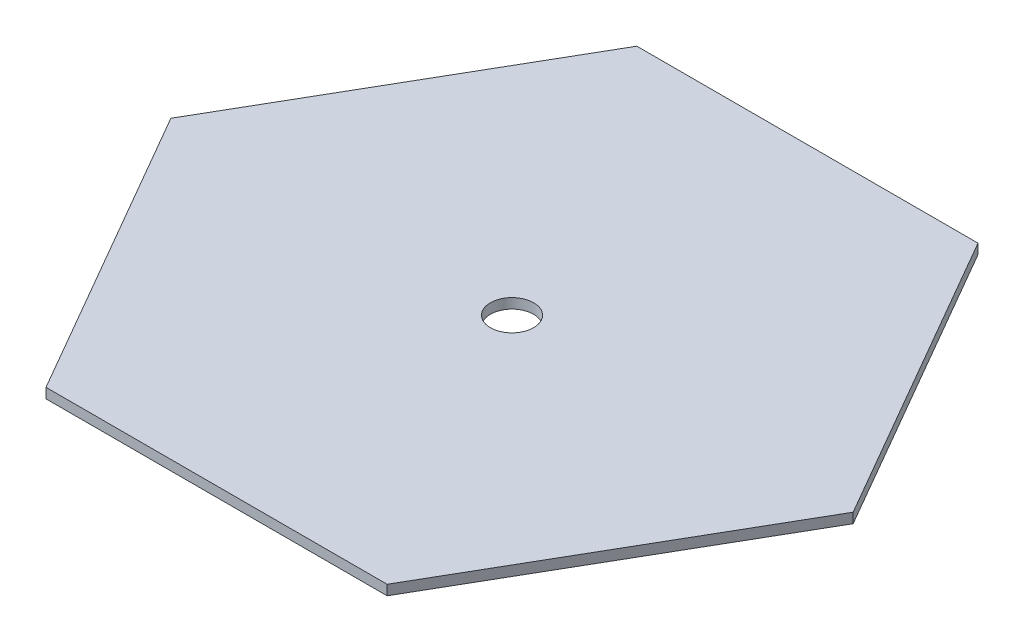
ISO-10303-21;
HEADER;
FILE_DESCRIPTION(('STEP AP214'),'2;1');
FILE_NAME('part.step','',(''),(''),'','','');
FILE_SCHEMA(('AUTOMOTIVE_DESIGN { 1 0 10303 214 1 1 1 1 }'));
ENDSEC;
DATA;
#1=APPLICATION_CONTEXT('core data for automotive mechanical design processes');
#2=APPLICATION_PROTOCOL_DEFINITION('international standard','automotive_design',2000,#1);
#3=PRODUCT_CONTEXT('',#1,'mechanical');
#4=PRODUCT('Part','Part','',(#3));
#5=PRODUCT_RELATED_PRODUCT_CATEGORY('part','',(#4));
#6=PRODUCT_DEFINITION_FORMATION('','',#4);
#7=PRODUCT_DEFINITION_CONTEXT('part definition',#1,'design');
#8=PRODUCT_DEFINITION('design','',#6,#7);
#9=PRODUCT_DEFINITION_SHAPE('','',#8);
#10=(LENGTH_UNIT() NAMED_UNIT(*) SI_UNIT(.MILLI.,.METRE.));
#11=(NAMED_UNIT(*) PLANE_ANGLE_UNIT() SI_UNIT($,.RADIAN.));
#12=(NAMED_UNIT(*) SI_UNIT($,.STERADIAN.) SOLID_ANGLE_UNIT());
#13=UNCERTAINTY_MEASURE_WITH_UNIT(LENGTH_MEASURE(1.E-05),#10,'distance_accuracy_value','');
#14=(GEOMETRIC_REPRESENTATION_CONTEXT(3) GLOBAL_UNCERTAINTY_ASSIGNED_CONTEXT((#13)) GLOBAL_UNIT_ASSIGNED_CONTEXT((#10,
#11,#12)) REPRESENTATION_CONTEXT('',''));
#15=CARTESIAN_POINT('',(0.,0.,0.));
#16=DIRECTION('',(0.,0.,1.));
#17=DIRECTION('',(1.,0.,0.));
#18=AXIS2_PLACEMENT_3D('',#15,#16,#17);
#19=CARTESIAN_POINT('',(0.,5.,0.));
#20=DIRECTION('',(0.,1.,0.));
#21=DIRECTION('',(0.,0.,1.));
#22=AXIS2_PLACEMENT_3D('',#19,#20,#21);
#23=PLANE('',#22);
#24=DIRECTION('',(1.,0.,0.));
#25=VECTOR('',#24,1.);
#26=CARTESIAN_POINT('',(-85.25,5.,147.657331345247));
#27=LINE('',#26,#25);
#28=CARTESIAN_POINT('',(-85.25,5.,147.657331345247));
#29=VERTEX_POINT('',#28);
#30=CARTESIAN_POINT('',(85.25,5.,147.657331345247));
#31=VERTEX_POINT('',#30);
#32=EDGE_CURVE('E129',#29,#31,#27,.T.);
#33=ORIENTED_EDGE('',*,*,#32,.T.);
#34=DIRECTION('',(0.5,0.,-0.866025403784439));
#35=VECTOR('',#34,1.);
#36=CARTESIAN_POINT('',(85.25,5.,147.657331345247));
#37=LINE('',#36,#35);
#38=CARTESIAN_POINT('',(170.5,5.,0.));
#39=VERTEX_POINT('',#38);
#40=EDGE_CURVE('E87',#31,#39,#37,.T.);
#41=ORIENTED_EDGE('',*,*,#40,.T.);
#42=DIRECTION('',(-0.5,0.,-0.866025403784439));
#43=VECTOR('',#42,1.);
#44=CARTESIAN_POINT('',(170.5,5.,0.));
#45=LINE('',#44,#43);
#46=CARTESIAN_POINT('',(85.25,5.,-147.657331345247));
#47=VERTEX_POINT('',#46);
#48=EDGE_CURVE('E100',#39,#47,#45,.T.);
#49=ORIENTED_EDGE('',*,*,#48,.T.);
#50=DIRECTION('',(-1.,0.,0.));
#51=VECTOR('',#50,1.);
#52=CARTESIAN_POINT('',(85.25,5.,-147.657331345247));
#53=LINE('',#52,#51);
#54=CARTESIAN_POINT('',(-85.25,5.,-147.657331345247));
#55=VERTEX_POINT('',#54);
#56=EDGE_CURVE('E94',#47,#55,#53,.T.);
#57=ORIENTED_EDGE('',*,*,#56,.T.);
#58=DIRECTION('',(-0.5,0.,0.866025403784439));
#59=VECTOR('',#58,1.);
#60=CARTESIAN_POINT('',(-85.25,5.,-147.657331345247));
#61=LINE('',#60,#59);
#62=CARTESIAN_POINT('',(-170.5,5.,0.));
#63=VERTEX_POINT('',#62);
#64=EDGE_CURVE('E98',#55,#63,#61,.T.);
#65=ORIENTED_EDGE('',*,*,#64,.T.);
#66=DIRECTION('',(0.5,0.,0.866025403784439));
#67=VECTOR('',#66,1.);
#68=CARTESIAN_POINT('',(-170.5,5.,0.));
#69=LINE('',#68,#67);
#70=EDGE_CURVE('E50',#63,#29,#69,.T.);
#71=ORIENTED_EDGE('',*,*,#70,.T.);
#72=EDGE_LOOP('',(#33,#41,#49,#57,#65,#71));
#73=FACE_BOUND('',#72,.T.);
#74=CARTESIAN_POINT('',(0.,5.,0.));
#75=DIRECTION('',(0.,1.,0.));
#76=DIRECTION('',(0.,0.,1.));
#77=AXIS2_PLACEMENT_3D('',#74,#75,#76);
#78=CIRCLE('',#77,10.81);
#79=CARTESIAN_POINT('',(0.,5.,10.81));
#80=VERTEX_POINT('',#79);
#81=EDGE_CURVE('E122',#80,#80,#78,.T.);
#82=ORIENTED_EDGE('',*,*,#81,.F.);
#83=EDGE_LOOP('',(#82));
#84=FACE_BOUND('',#83,.T.);
#85=ADVANCED_FACE('F33',(#73,#84),#23,.T.);
#86=CARTESIAN_POINT('',(0.,0.,0.));
#87=DIRECTION('',(0.,1.,0.));
#88=DIRECTION('',(0.,0.,1.));
#89=AXIS2_PLACEMENT_3D('',#86,#87,#88);
#90=PLANE('',#89);
#91=DIRECTION('',(1.,0.,0.));
#92=VECTOR('',#91,1.);
#93=CARTESIAN_POINT('',(-85.25,0.,147.657331345247));
#94=LINE('',#93,#92);
#95=CARTESIAN_POINT('',(-85.25,0.,147.657331345247));
#96=VERTEX_POINT('',#95);
#97=CARTESIAN_POINT('',(85.25,0.,147.657331345247));
#98=VERTEX_POINT('',#97);
#99=EDGE_CURVE('E118',#96,#98,#94,.T.);
#100=ORIENTED_EDGE('',*,*,#99,.F.);
#101=DIRECTION('',(0.5,0.,0.866025403784439));
#102=VECTOR('',#101,1.);
#103=CARTESIAN_POINT('',(-170.5,0.,0.));
#104=LINE('',#103,#102);
#105=CARTESIAN_POINT('',(-170.5,0.,0.));
#106=VERTEX_POINT('',#105);
#107=EDGE_CURVE('E79',#106,#96,#104,.T.);
#108=ORIENTED_EDGE('',*,*,#107,.F.);
#109=DIRECTION('',(-0.5,0.,0.866025403784439));
#110=VECTOR('',#109,1.);
#111=CARTESIAN_POINT('',(-85.25,0.,-147.657331345247));
#112=LINE('',#111,#110);
#113=CARTESIAN_POINT('',(-85.25,0.,-147.657331345247));
#114=VERTEX_POINT('',#113);
#115=EDGE_CURVE('E73',#114,#106,#112,.T.);
#116=ORIENTED_EDGE('',*,*,#115,.F.);
#117=DIRECTION('',(-1.,0.,0.));
#118=VECTOR('',#117,1.);
#119=CARTESIAN_POINT('',(85.25,0.,-147.657331345247));
#120=LINE('',#119,#118);
#121=CARTESIAN_POINT('',(85.25,0.,-147.657331345247));
#122=VERTEX_POINT('',#121);
#123=EDGE_CURVE('E108',#122,#114,#120,.T.);
#124=ORIENTED_EDGE('',*,*,#123,.F.);
#125=DIRECTION('',(-0.5,0.,-0.866025403784439));
#126=VECTOR('',#125,1.);
#127=CARTESIAN_POINT('',(170.5,0.,0.));
#128=LINE('',#127,#126);
#129=CARTESIAN_POINT('',(170.5,0.,0.));
#130=VERTEX_POINT('',#129);
#131=EDGE_CURVE('E124',#130,#122,#128,.T.);
#132=ORIENTED_EDGE('',*,*,#131,.F.);
#133=DIRECTION('',(0.5,0.,-0.866025403784439));
#134=VECTOR('',#133,1.);
#135=CARTESIAN_POINT('',(85.25,0.,147.657331345247));
#136=LINE('',#135,#134);
#137=EDGE_CURVE('E121',#98,#130,#136,.T.);
#138=ORIENTED_EDGE('',*,*,#137,.F.);
#139=EDGE_LOOP('',(#100,#108,#116,#124,#132,#138));
#140=FACE_BOUND('',#139,.T.);
#141=CARTESIAN_POINT('',(0.,0.,0.));
#142=DIRECTION('',(0.,1.,0.));
#143=DIRECTION('',(0.,0.,1.));
#144=AXIS2_PLACEMENT_3D('',#141,#142,#143);
#145=CIRCLE('',#144,10.81);
#146=CARTESIAN_POINT('',(0.,0.,10.81));
#147=VERTEX_POINT('',#146);
#148=EDGE_CURVE('E222',#147,#147,#145,.T.);
#149=ORIENTED_EDGE('',*,*,#148,.T.);
#150=EDGE_LOOP('',(#149));
#151=FACE_BOUND('',#150,.T.);
#152=ADVANCED_FACE('F138',(#140,#151),#90,.F.);
#153=CARTESIAN_POINT('',(-85.25,5.,147.657331345247));
#154=DIRECTION('',(0.,0.,-1.));
#155=DIRECTION('',(-1.,0.,0.));
#156=AXIS2_PLACEMENT_3D('',#153,#154,#155);
#157=PLANE('',#156);
#158=ORIENTED_EDGE('',*,*,#99,.T.);
#159=DIRECTION('',(0.,-1.,0.));
#160=VECTOR('',#159,1.);
#161=CARTESIAN_POINT('',(85.25,5.,147.657331345247));
#162=LINE('',#161,#160);
#163=EDGE_CURVE('E11',#31,#98,#162,.T.);
#164=ORIENTED_EDGE('',*,*,#163,.F.);
#165=ORIENTED_EDGE('',*,*,#32,.F.);
#166=DIRECTION('',(0.,-1.,0.));
#167=VECTOR('',#166,1.);
#168=CARTESIAN_POINT('',(-85.25,5.,147.657331345247));
#169=LINE('',#168,#167);
#170=EDGE_CURVE('E114',#29,#96,#169,.T.);
#171=ORIENTED_EDGE('',*,*,#170,.T.);
#172=EDGE_LOOP('',(#158,#164,#165,#171));
#173=FACE_BOUND('',#172,.T.);
#174=ADVANCED_FACE('F35',(#173),#157,.F.);
#175=CARTESIAN_POINT('',(85.25,5.,147.657331345247));
#176=DIRECTION('',(-0.866025403784439,0.,-0.5));
#177=DIRECTION('',(-0.5,0.,0.866025403784439));
#178=AXIS2_PLACEMENT_3D('',#175,#176,#177);
#179=PLANE('',#178);
#180=ORIENTED_EDGE('',*,*,#137,.T.);
#181=DIRECTION('',(0.,-1.,0.));
#182=VECTOR('',#181,1.);
#183=CARTESIAN_POINT('',(170.5,5.,0.));
#184=LINE('',#183,#182);
#185=EDGE_CURVE('E42',#39,#130,#184,.T.);
#186=ORIENTED_EDGE('',*,*,#185,.F.);
#187=ORIENTED_EDGE('',*,*,#40,.F.);
#188=ORIENTED_EDGE('',*,*,#163,.T.);
#189=EDGE_LOOP('',(#180,#186,#187,#188));
#190=FACE_BOUND('',#189,.T.);
#191=ADVANCED_FACE('F163',(#190),#179,.F.);
#192=CARTESIAN_POINT('',(170.5,5.,0.));
#193=DIRECTION('',(-0.866025403784439,0.,0.5));
#194=DIRECTION('',(0.5,0.,0.866025403784439));
#195=AXIS2_PLACEMENT_3D('',#192,#193,#194);
#196=PLANE('',#195);
#197=ORIENTED_EDGE('',*,*,#131,.T.);
#198=DIRECTION('',(0.,-1.,0.));
#199=VECTOR('',#198,1.);
#200=CARTESIAN_POINT('',(85.25,5.,-147.657331345247));
#201=LINE('',#200,#199);
#202=EDGE_CURVE('E109',#47,#122,#201,.T.);
#203=ORIENTED_EDGE('',*,*,#202,.F.);
#204=ORIENTED_EDGE('',*,*,#48,.F.);
#205=ORIENTED_EDGE('',*,*,#185,.T.);
#206=EDGE_LOOP('',(#197,#203,#204,#205));
#207=FACE_BOUND('',#206,.T.);
#208=ADVANCED_FACE('F135',(#207),#196,.F.);
#209=CARTESIAN_POINT('',(85.25,5.,-147.657331345247));
#210=DIRECTION('',(0.,0.,1.));
#211=DIRECTION('',(1.,0.,0.));
#212=AXIS2_PLACEMENT_3D('',#209,#210,#211);
#213=PLANE('',#212);
#214=ORIENTED_EDGE('',*,*,#123,.T.);
#215=DIRECTION('',(0.,-1.,0.));
#216=VECTOR('',#215,1.);
#217=CARTESIAN_POINT('',(-85.25,5.,-147.657331345247));
#218=LINE('',#217,#216);
#219=EDGE_CURVE('E105',#55,#114,#218,.T.);
#220=ORIENTED_EDGE('',*,*,#219,.F.);
#221=ORIENTED_EDGE('',*,*,#56,.F.);
#222=ORIENTED_EDGE('',*,*,#202,.T.);
#223=EDGE_LOOP('',(#214,#220,#221,#222));
#224=FACE_BOUND('',#223,.T.);
#225=ADVANCED_FACE('F106',(#224),#213,.F.);
#226=CARTESIAN_POINT('',(-85.25,5.,-147.657331345247));
#227=DIRECTION('',(0.866025403784439,0.,0.5));
#228=DIRECTION('',(0.5,0.,-0.866025403784439));
#229=AXIS2_PLACEMENT_3D('',#226,#227,#228);
#230=PLANE('',#229);
#231=ORIENTED_EDGE('',*,*,#115,.T.);
#232=DIRECTION('',(0.,-1.,0.));
#233=VECTOR('',#232,1.);
#234=CARTESIAN_POINT('',(-170.5,5.,0.));
#235=LINE('',#234,#233);
#236=EDGE_CURVE('E110',#63,#106,#235,.T.);
#237=ORIENTED_EDGE('',*,*,#236,.F.);
#238=ORIENTED_EDGE('',*,*,#64,.F.);
#239=ORIENTED_EDGE('',*,*,#219,.T.);
#240=EDGE_LOOP('',(#231,#237,#238,#239));
#241=FACE_BOUND('',#240,.T.);
#242=ADVANCED_FACE('F112',(#241),#230,.F.);
#243=CARTESIAN_POINT('',(-170.5,5.,0.));
#244=DIRECTION('',(0.866025403784439,0.,-0.5));
#245=DIRECTION('',(-0.5,0.,-0.866025403784439));
#246=AXIS2_PLACEMENT_3D('',#243,#244,#245);
#247=PLANE('',#246);
#248=ORIENTED_EDGE('',*,*,#107,.T.);
#249=ORIENTED_EDGE('',*,*,#170,.F.);
#250=ORIENTED_EDGE('',*,*,#70,.F.);
#251=ORIENTED_EDGE('',*,*,#236,.T.);
#252=EDGE_LOOP('',(#248,#249,#250,#251));
#253=FACE_BOUND('',#252,.T.);
#254=ADVANCED_FACE('F143',(#253),#247,.F.);
#255=CARTESIAN_POINT('',(0.,5.,0.));
#256=DIRECTION('',(0.,-1.,0.));
#257=DIRECTION('',(0.,0.,-1.));
#258=AXIS2_PLACEMENT_3D('',#255,#256,#257);
#259=CYLINDRICAL_SURFACE('',#258,10.81);
#260=ORIENTED_EDGE('',*,*,#81,.T.);
#261=EDGE_LOOP('',(#260));
#262=FACE_BOUND('',#261,.T.);
#263=ORIENTED_EDGE('',*,*,#148,.F.);
#264=EDGE_LOOP('',(#263));
#265=FACE_BOUND('',#264,.T.);
#266=ADVANCED_FACE('F145',(#262,#265),#259,.F.);
#267=CLOSED_SHELL('',(#85,#152,#174,#191,#208,#225,#242,#254,#266));
#268=MANIFOLD_SOLID_BREP('B2',#267);
#269=ADVANCED_BREP_SHAPE_REPRESENTATION('',(#18,#268),#14);
#270=SHAPE_DEFINITION_REPRESENTATION(#9,#269);
ENDSEC;
END-ISO-10303-21;
